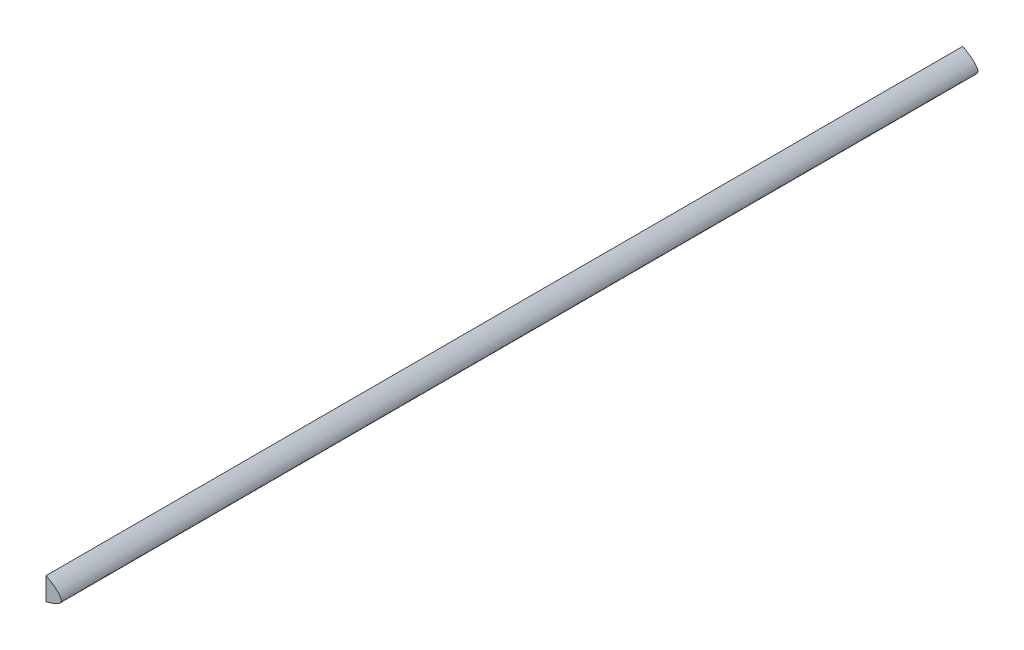
ISO-10303-21;
HEADER;
FILE_DESCRIPTION(('STEP AP214'),'2;1');
FILE_NAME('part.step','',(''),(''),'','','');
FILE_SCHEMA(('AUTOMOTIVE_DESIGN { 1 0 10303 214 1 1 1 1 }'));
ENDSEC;
DATA;
#1=APPLICATION_CONTEXT('core data for automotive mechanical design processes');
#2=APPLICATION_PROTOCOL_DEFINITION('international standard','automotive_design',2000,#1);
#3=PRODUCT_CONTEXT('',#1,'mechanical');
#4=PRODUCT('Part','Part','',(#3));
#5=PRODUCT_RELATED_PRODUCT_CATEGORY('part','',(#4));
#6=PRODUCT_DEFINITION_FORMATION('','',#4);
#7=PRODUCT_DEFINITION_CONTEXT('part definition',#1,'design');
#8=PRODUCT_DEFINITION('design','',#6,#7);
#9=PRODUCT_DEFINITION_SHAPE('','',#8);
#10=(LENGTH_UNIT() NAMED_UNIT(*) SI_UNIT(.MILLI.,.METRE.));
#11=(NAMED_UNIT(*) PLANE_ANGLE_UNIT() SI_UNIT($,.RADIAN.));
#12=(NAMED_UNIT(*) SI_UNIT($,.STERADIAN.) SOLID_ANGLE_UNIT());
#13=UNCERTAINTY_MEASURE_WITH_UNIT(LENGTH_MEASURE(1.E-05),#10,'distance_accuracy_value','');
#14=(GEOMETRIC_REPRESENTATION_CONTEXT(3) GLOBAL_UNCERTAINTY_ASSIGNED_CONTEXT((#13)) GLOBAL_UNIT_ASSIGNED_CONTEXT((#10,
#11,#12)) REPRESENTATION_CONTEXT('',''));
#15=CARTESIAN_POINT('',(0.,0.,0.));
#16=DIRECTION('',(0.,0.,1.));
#17=DIRECTION('',(1.,0.,0.));
#18=AXIS2_PLACEMENT_3D('',#15,#16,#17);
#19=CARTESIAN_POINT('',(0.,0.,-761.999746));
#20=DIRECTION('',(0.,0.,-1.));
#21=DIRECTION('',(-1.,0.,0.));
#22=AXIS2_PLACEMENT_3D('',#19,#20,#21);
#23=PLANE('',#22);
#24=CARTESIAN_POINT('',(-357.6495768,0.,-761.999746));
#25=CARTESIAN_POINT('',(-357.648726861376,-0.0257455572910462,-761.999746));
#26=CARTESIAN_POINT('',(-354.95727209637,0.0430546550360694,-761.999746));
#27=CARTESIAN_POINT('',(-352.252509359615,-0.129032965371311,-761.999746));
#28=CARTESIAN_POINT('',(-345.839521917533,-0.406133073157836,-761.999746));
#29=CARTESIAN_POINT('',(-338.12456303809,-0.910151364784343,-761.999746));
#30=CARTESIAN_POINT('',(-328.210351967454,-1.43852531925133,-761.999746));
#31=CARTESIAN_POINT('',(-316.612136086776,-2.02069580310001,-761.999746));
#32=CARTESIAN_POINT('',(-303.314765848886,-2.69217460861265,-761.999746));
#33=CARTESIAN_POINT('',(-288.537244692712,-3.47532619062215,-761.999746));
#34=CARTESIAN_POINT('',(-272.46518336393,-4.36701221843547,-761.999746));
#35=CARTESIAN_POINT('',(-255.320104090206,-5.3536446318852,-761.999746));
#36=CARTESIAN_POINT('',(-237.326277664919,-6.42526658413433,-761.999746));
#37=CARTESIAN_POINT('',(-218.720973618498,-7.55250034629027,-761.999746));
#38=CARTESIAN_POINT('',(-199.744199132284,-8.71185745862187,-761.999746));
#39=CARTESIAN_POINT('',(-180.642422071267,-9.8572300632981,-761.999746));
#40=CARTESIAN_POINT('',(-161.661678951748,-10.9405310919227,-761.999746));
#41=CARTESIAN_POINT('',(-143.025643591958,-11.8868463949373,-761.999746));
#42=CARTESIAN_POINT('',(-124.905168706553,-12.5651088804298,-761.999746));
#43=CARTESIAN_POINT('',(-107.443529756709,-12.9136554715501,-761.999746));
#44=CARTESIAN_POINT('',(-90.7897217382014,-13.0132010825939,-761.999746));
#45=CARTESIAN_POINT('',(-75.1117351145609,-12.860660166562,-761.999746));
#46=CARTESIAN_POINT('',(-60.5841901433603,-12.4624056014747,-761.999746));
#47=CARTESIAN_POINT('',(-47.3621543247653,-11.8026738466849,-761.999746));
#48=CARTESIAN_POINT('',(-35.582842736121,-10.881324092175,-761.999746));
#49=CARTESIAN_POINT('',(-25.3534528134309,-9.70173739095846,-761.999746));
#50=CARTESIAN_POINT('',(-16.7799983149518,-8.25111039585946,-761.999746));
#51=CARTESIAN_POINT('',(-9.87542917398952,-6.636452020727,-761.999746));
#52=CARTESIAN_POINT('',(-4.80498724836757,-4.65277940167213,-761.999746));
#53=CARTESIAN_POINT('',(-1.25723768747931,-2.92852094482158,-761.999746));
#54=CARTESIAN_POINT('',(0.487670047204104,-0.0180312769451604,-761.999746));
#55=CARTESIAN_POINT('',(-1.18020539645498,2.96932580564775,-761.999746));
#56=CARTESIAN_POINT('',(-3.81583902671143,5.9031060482646,-761.999746));
#57=CARTESIAN_POINT('',(-8.13905195070425,9.10746932339869,-761.999746));
#58=CARTESIAN_POINT('',(-13.8914371976012,12.3237164418778,-761.999746));
#59=CARTESIAN_POINT('',(-21.1318126217946,15.5017839571303,-761.999746));
#60=CARTESIAN_POINT('',(-29.7713974500726,18.5449825075212,-761.999746));
#61=CARTESIAN_POINT('',(-39.7522709934014,21.3790561596477,-761.999746));
#62=CARTESIAN_POINT('',(-50.9728087742978,23.9485342689099,-761.999746));
#63=CARTESIAN_POINT('',(-63.3271747979513,26.1867718902102,-761.999746));
#64=CARTESIAN_POINT('',(-76.6903038222001,28.0307898502846,-761.999746));
#65=CARTESIAN_POINT('',(-90.9433495275859,29.415500622072,-761.999746));
#66=CARTESIAN_POINT('',(-105.989881507942,30.2107947542356,-761.999746));
#67=CARTESIAN_POINT('',(-121.743656538008,30.3921609512369,-761.999746));
#68=CARTESIAN_POINT('',(-138.125753593203,29.9470374556974,-761.999746));
#69=CARTESIAN_POINT('',(-155.046694559356,28.9095802371024,-761.999746));
#70=CARTESIAN_POINT('',(-172.408579332207,27.3328076494178,-761.999746));
#71=CARTESIAN_POINT('',(-190.087035591286,25.3152052593147,-761.999746));
#72=CARTESIAN_POINT('',(-207.920859479651,23.0318128032209,-761.999746));
#73=CARTESIAN_POINT('',(-225.698984189918,20.6027037735159,-761.999746));
#74=CARTESIAN_POINT('',(-243.181526396299,18.091258120494,-761.999746));
#75=CARTESIAN_POINT('',(-260.13922248756,15.5902976030219,-761.999746));
#76=CARTESIAN_POINT('',(-276.339957136469,13.1505380743263,-761.999746));
#77=CARTESIAN_POINT('',(-291.56396185533,10.8192660446522,-761.999746));
#78=CARTESIAN_POINT('',(-305.595219858194,8.6506948413944,-761.999746));
#79=CARTESIAN_POINT('',(-318.248236887196,6.6648279530017,-761.999746));
#80=CARTESIAN_POINT('',(-329.308114231144,4.89193261496094,-761.999746));
#81=CARTESIAN_POINT('',(-338.781253094512,3.26550493388586,-761.999746));
#82=CARTESIAN_POINT('',(-346.176304677791,1.86759950346183,-761.999746));
#83=CARTESIAN_POINT('',(-352.370656862766,0.802364026765671,-761.999746));
#84=CARTESIAN_POINT('',(-354.99806757049,0.293773121072747,-761.999746));
#85=CARTESIAN_POINT('',(-357.650424016708,0.025663107521496,-761.999746));
#86=CARTESIAN_POINT('',(-357.6495768,0.,-761.999746));
#87=B_SPLINE_CURVE_WITH_KNOTS('',3,(#24,#25,#26,#27,#28,#29,#30,#31,#32,#33,#34,#35,#36,#37,#38,
#39,#40,#41,#42,#43,#44,#45,#46,#47,#48,#49,#50,#51,#52,#53,#54,#55,#56,#57,#58,#59,#60,#61,#62,
#63,#64,#65,#66,#67,#68,#69,#70,#71,#72,#73,#74,#75,#76,#77,#78,#79,#80,#81,#82,#83,#84,#85,
#86),.UNSPECIFIED.,.T.,.F.,(4,1,1,1,1,1,1,1,1,1,1,1,1,1,1,1,1,1,1,1,1,1,1,1,1,1,1,1,1,1,1,1,1,1,
1,1,1,1,1,1,1,1,1,1,1,1,1,1,1,1,1,1,1,1,1,1,1,1,1,1,4),(0.,0.00175369780816892,
0.00688865956314488,0.0150923025389886,0.0260705624445412,0.0396341231207822,0.0556736872431635,
0.0740348611839932,0.0944591609311742,0.116662173474013,0.140358718672501,0.165224083535155,
0.190937550434525,0.217163338877499,0.243564475453284,0.269788575421464,0.295501431380781,
0.320452916753595,0.344503634568004,0.367464141025741,0.389074612810261,0.409105471364504,
0.427344498250884,0.443617520922597,0.457786354918441,0.469750876859431,0.47945377095506,
0.486908806682988,0.492196223633669,0.495548631984138,0.499383016984256,0.504909969436302,
0.512185650881719,0.521248351858979,0.532096115453832,0.544700028478094,0.558973210086569,
0.574822851386883,0.592114304239246,0.610691624255903,0.630393060413666,0.651103436631961,
0.67275850299212,0.695294236993928,0.71861636740432,0.742601232614042,0.767120584088619,
0.791930052571172,0.816685006986028,0.841056018593425,0.864706871110748,0.887315386476924,
0.908565467206016,0.928165908499566,0.945829219590711,0.961305843038647,0.9744276754812,
0.985119780533907,0.993172635388474,0.998251918383336,1.),.UNSPECIFIED.);
#88=CARTESIAN_POINT('',(-12.7000000000002,-7.2626912939508,-761.999746));
#89=VERTEX_POINT('',#88);
#90=CARTESIAN_POINT('',(-12.7,11.588344324976,-761.999746));
#91=VERTEX_POINT('',#90);
#92=EDGE_CURVE('E11',#89,#91,#87,.T.);
#93=ORIENTED_EDGE('',*,*,#92,.F.);
#94=DIRECTION('',(0.,-1.,0.));
#95=VECTOR('',#94,1.);
#96=CARTESIAN_POINT('',(-12.7000000000002,1.66533453693773E-13,-761.999746));
#97=LINE('',#96,#95);
#98=EDGE_CURVE('E55',#91,#89,#97,.T.);
#99=ORIENTED_EDGE('',*,*,#98,.F.);
#100=EDGE_LOOP('',(#93,#99));
#101=FACE_BOUND('',#100,.T.);
#102=ADVANCED_FACE('F33',(#101),#23,.T.);
#103=CARTESIAN_POINT('',(-1.2677296123001,2.86302360731041,0.));
#104=DIRECTION('',(0.,0.,-1.));
#105=DIRECTION('',(-1.,0.,0.));
#106=AXIS2_PLACEMENT_3D('',#103,#104,#105);
#107=PLANE('',#106);
#108=DIRECTION('',(0.,-1.,0.));
#109=VECTOR('',#108,1.);
#110=CARTESIAN_POINT('',(-12.7000000000002,1.66533453693773E-13,0.));
#111=LINE('',#110,#109);
#112=CARTESIAN_POINT('',(-12.7,11.588344324976,0.));
#113=VERTEX_POINT('',#112);
#114=CARTESIAN_POINT('',(-12.7000000000003,-7.2626912939508,0.));
#115=VERTEX_POINT('',#114);
#116=EDGE_CURVE('E50',#113,#115,#111,.T.);
#117=ORIENTED_EDGE('',*,*,#116,.T.);
#118=CARTESIAN_POINT('',(-357.6495768,0.,0.));
#119=CARTESIAN_POINT('',(-357.648726861376,-0.0257455572910462,0.));
#120=CARTESIAN_POINT('',(-354.95727209637,0.0430546550360694,0.));
#121=CARTESIAN_POINT('',(-352.252509359615,-0.129032965371311,0.));
#122=CARTESIAN_POINT('',(-345.839521917533,-0.406133073157836,0.));
#123=CARTESIAN_POINT('',(-338.12456303809,-0.910151364784343,0.));
#124=CARTESIAN_POINT('',(-328.210351967454,-1.43852531925133,0.));
#125=CARTESIAN_POINT('',(-316.612136086776,-2.02069580310001,0.));
#126=CARTESIAN_POINT('',(-303.314765848886,-2.69217460861265,0.));
#127=CARTESIAN_POINT('',(-288.537244692712,-3.47532619062215,0.));
#128=CARTESIAN_POINT('',(-272.46518336393,-4.36701221843547,0.));
#129=CARTESIAN_POINT('',(-255.320104090206,-5.3536446318852,0.));
#130=CARTESIAN_POINT('',(-237.326277664919,-6.42526658413433,0.));
#131=CARTESIAN_POINT('',(-218.720973618498,-7.55250034629027,0.));
#132=CARTESIAN_POINT('',(-199.744199132284,-8.71185745862187,0.));
#133=CARTESIAN_POINT('',(-180.642422071267,-9.8572300632981,0.));
#134=CARTESIAN_POINT('',(-161.661678951748,-10.9405310919227,0.));
#135=CARTESIAN_POINT('',(-143.025643591958,-11.8868463949373,0.));
#136=CARTESIAN_POINT('',(-124.905168706553,-12.5651088804298,0.));
#137=CARTESIAN_POINT('',(-107.443529756709,-12.9136554715501,0.));
#138=CARTESIAN_POINT('',(-90.7897217382014,-13.0132010825939,0.));
#139=CARTESIAN_POINT('',(-75.1117351145609,-12.860660166562,0.));
#140=CARTESIAN_POINT('',(-60.5841901433603,-12.4624056014747,0.));
#141=CARTESIAN_POINT('',(-47.3621543247653,-11.8026738466849,0.));
#142=CARTESIAN_POINT('',(-35.582842736121,-10.881324092175,0.));
#143=CARTESIAN_POINT('',(-25.3534528134309,-9.70173739095846,0.));
#144=CARTESIAN_POINT('',(-16.7799983149518,-8.25111039585946,0.));
#145=CARTESIAN_POINT('',(-9.87542917398952,-6.636452020727,0.));
#146=CARTESIAN_POINT('',(-4.80498724836757,-4.65277940167213,0.));
#147=CARTESIAN_POINT('',(-1.25723768747931,-2.92852094482158,0.));
#148=CARTESIAN_POINT('',(0.487670047204104,-0.0180312769451604,0.));
#149=CARTESIAN_POINT('',(-1.18020539645498,2.96932580564775,0.));
#150=CARTESIAN_POINT('',(-3.81583902671143,5.9031060482646,0.));
#151=CARTESIAN_POINT('',(-8.13905195070425,9.10746932339869,0.));
#152=CARTESIAN_POINT('',(-13.8914371976012,12.3237164418778,0.));
#153=CARTESIAN_POINT('',(-21.1318126217946,15.5017839571303,0.));
#154=CARTESIAN_POINT('',(-29.7713974500726,18.5449825075212,0.));
#155=CARTESIAN_POINT('',(-39.7522709934014,21.3790561596477,0.));
#156=CARTESIAN_POINT('',(-50.9728087742978,23.9485342689099,0.));
#157=CARTESIAN_POINT('',(-63.3271747979513,26.1867718902102,0.));
#158=CARTESIAN_POINT('',(-76.6903038222001,28.0307898502846,0.));
#159=CARTESIAN_POINT('',(-90.9433495275859,29.415500622072,0.));
#160=CARTESIAN_POINT('',(-105.989881507942,30.2107947542356,0.));
#161=CARTESIAN_POINT('',(-121.743656538008,30.3921609512369,0.));
#162=CARTESIAN_POINT('',(-138.125753593203,29.9470374556974,0.));
#163=CARTESIAN_POINT('',(-155.046694559356,28.9095802371024,0.));
#164=CARTESIAN_POINT('',(-172.408579332207,27.3328076494178,0.));
#165=CARTESIAN_POINT('',(-190.087035591286,25.3152052593147,0.));
#166=CARTESIAN_POINT('',(-207.920859479651,23.0318128032209,0.));
#167=CARTESIAN_POINT('',(-225.698984189918,20.6027037735159,0.));
#168=CARTESIAN_POINT('',(-243.181526396299,18.091258120494,0.));
#169=CARTESIAN_POINT('',(-260.13922248756,15.5902976030219,0.));
#170=CARTESIAN_POINT('',(-276.339957136469,13.1505380743263,0.));
#171=CARTESIAN_POINT('',(-291.56396185533,10.8192660446522,0.));
#172=CARTESIAN_POINT('',(-305.595219858194,8.6506948413944,0.));
#173=CARTESIAN_POINT('',(-318.248236887196,6.6648279530017,0.));
#174=CARTESIAN_POINT('',(-329.308114231144,4.89193261496094,0.));
#175=CARTESIAN_POINT('',(-338.781253094512,3.26550493388586,0.));
#176=CARTESIAN_POINT('',(-346.176304677791,1.86759950346183,0.));
#177=CARTESIAN_POINT('',(-352.370656862766,0.802364026765671,0.));
#178=CARTESIAN_POINT('',(-354.99806757049,0.293773121072747,0.));
#179=CARTESIAN_POINT('',(-357.650424016708,0.025663107521496,0.));
#180=CARTESIAN_POINT('',(-357.6495768,0.,0.));
#181=B_SPLINE_CURVE_WITH_KNOTS('',3,(#118,#119,#120,#121,#122,#123,#124,#125,#126,#127,#128,
#129,#130,#131,#132,#133,#134,#135,#136,#137,#138,#139,#140,#141,#142,#143,#144,#145,#146,#147,
#148,#149,#150,#151,#152,#153,#154,#155,#156,#157,#158,#159,#160,#161,#162,#163,#164,#165,#166,
#167,#168,#169,#170,#171,#172,#173,#174,#175,#176,#177,#178,#179,#180),.UNSPECIFIED.,.T.,.F.,(4,
1,1,1,1,1,1,1,1,1,1,1,1,1,1,1,1,1,1,1,1,1,1,1,1,1,1,1,1,1,1,1,1,1,1,1,1,1,1,1,1,1,1,1,1,1,1,1,1,
1,1,1,1,1,1,1,1,1,1,1,4),(0.,0.00175369780816892,0.00688865956314488,0.0150923025389886,
0.0260705624445412,0.0396341231207822,0.0556736872431635,0.0740348611839932,0.0944591609311742,
0.116662173474013,0.140358718672501,0.165224083535155,0.190937550434525,0.217163338877499,
0.243564475453284,0.269788575421464,0.295501431380781,0.320452916753595,0.344503634568004,
0.367464141025741,0.389074612810261,0.409105471364504,0.427344498250884,0.443617520922597,
0.457786354918441,0.469750876859431,0.47945377095506,0.486908806682988,0.492196223633669,
0.495548631984138,0.499383016984256,0.504909969436302,0.512185650881719,0.521248351858979,
0.532096115453832,0.544700028478094,0.558973210086569,0.574822851386883,0.592114304239246,
0.610691624255903,0.630393060413666,0.651103436631961,0.67275850299212,0.695294236993928,
0.71861636740432,0.742601232614042,0.767120584088619,0.791930052571172,0.816685006986028,
0.841056018593425,0.864706871110748,0.887315386476924,0.908565467206016,0.928165908499566,
0.945829219590711,0.961305843038647,0.9744276754812,0.985119780533907,0.993172635388474,
0.998251918383336,1.),.UNSPECIFIED.);
#182=EDGE_CURVE('E43',#115,#113,#181,.T.);
#183=ORIENTED_EDGE('',*,*,#182,.T.);
#184=EDGE_LOOP('',(#117,#183));
#185=FACE_BOUND('',#184,.T.);
#186=ADVANCED_FACE('F84',(#185),#107,.F.);
#187=CARTESIAN_POINT('',(-357.6495768,0.,-1123.4349097049));
#188=CARTESIAN_POINT('',(-357.648726861376,-0.0257455572910462,-1123.4349097049));
#189=CARTESIAN_POINT('',(-354.95727209637,0.0430546550360694,-1123.4349097049));
#190=CARTESIAN_POINT('',(-352.252509359615,-0.129032965371311,-1123.4349097049));
#191=CARTESIAN_POINT('',(-345.839521917533,-0.406133073157836,-1123.4349097049));
#192=CARTESIAN_POINT('',(-338.12456303809,-0.910151364784343,-1123.4349097049));
#193=CARTESIAN_POINT('',(-328.210351967454,-1.43852531925133,-1123.4349097049));
#194=CARTESIAN_POINT('',(-316.612136086776,-2.02069580310001,-1123.4349097049));
#195=CARTESIAN_POINT('',(-303.314765848886,-2.69217460861265,-1123.4349097049));
#196=CARTESIAN_POINT('',(-288.537244692712,-3.47532619062215,-1123.4349097049));
#197=CARTESIAN_POINT('',(-272.46518336393,-4.36701221843547,-1123.4349097049));
#198=CARTESIAN_POINT('',(-255.320104090206,-5.3536446318852,-1123.4349097049));
#199=CARTESIAN_POINT('',(-237.326277664919,-6.42526658413433,-1123.4349097049));
#200=CARTESIAN_POINT('',(-218.720973618498,-7.55250034629027,-1123.4349097049));
#201=CARTESIAN_POINT('',(-199.744199132284,-8.71185745862187,-1123.4349097049));
#202=CARTESIAN_POINT('',(-180.642422071267,-9.8572300632981,-1123.4349097049));
#203=CARTESIAN_POINT('',(-161.661678951748,-10.9405310919227,-1123.4349097049));
#204=CARTESIAN_POINT('',(-143.025643591958,-11.8868463949373,-1123.4349097049));
#205=CARTESIAN_POINT('',(-124.905168706553,-12.5651088804298,-1123.4349097049));
#206=CARTESIAN_POINT('',(-107.443529756709,-12.9136554715501,-1123.4349097049));
#207=CARTESIAN_POINT('',(-90.7897217382014,-13.0132010825939,-1123.4349097049));
#208=CARTESIAN_POINT('',(-75.1117351145609,-12.860660166562,-1123.4349097049));
#209=CARTESIAN_POINT('',(-60.5841901433603,-12.4624056014747,-1123.4349097049));
#210=CARTESIAN_POINT('',(-47.3621543247653,-11.8026738466849,-1123.4349097049));
#211=CARTESIAN_POINT('',(-35.582842736121,-10.881324092175,-1123.4349097049));
#212=CARTESIAN_POINT('',(-25.3534528134309,-9.70173739095846,-1123.4349097049));
#213=CARTESIAN_POINT('',(-16.7799983149518,-8.25111039585946,-1123.4349097049));
#214=CARTESIAN_POINT('',(-9.87542917398952,-6.636452020727,-1123.4349097049));
#215=CARTESIAN_POINT('',(-4.80498724836757,-4.65277940167213,-1123.4349097049));
#216=CARTESIAN_POINT('',(-1.25723768747931,-2.92852094482158,-1123.4349097049));
#217=CARTESIAN_POINT('',(0.487670047204104,-0.0180312769451604,-1123.4349097049));
#218=CARTESIAN_POINT('',(-1.18020539645498,2.96932580564775,-1123.4349097049));
#219=CARTESIAN_POINT('',(-3.81583902671143,5.9031060482646,-1123.4349097049));
#220=CARTESIAN_POINT('',(-8.13905195070425,9.10746932339869,-1123.4349097049));
#221=CARTESIAN_POINT('',(-13.8914371976012,12.3237164418778,-1123.4349097049));
#222=CARTESIAN_POINT('',(-21.1318126217946,15.5017839571303,-1123.4349097049));
#223=CARTESIAN_POINT('',(-29.7713974500726,18.5449825075212,-1123.4349097049));
#224=CARTESIAN_POINT('',(-39.7522709934014,21.3790561596477,-1123.4349097049));
#225=CARTESIAN_POINT('',(-50.9728087742978,23.9485342689099,-1123.4349097049));
#226=CARTESIAN_POINT('',(-63.3271747979513,26.1867718902102,-1123.4349097049));
#227=CARTESIAN_POINT('',(-76.6903038222001,28.0307898502846,-1123.4349097049));
#228=CARTESIAN_POINT('',(-90.9433495275859,29.415500622072,-1123.4349097049));
#229=CARTESIAN_POINT('',(-105.989881507942,30.2107947542356,-1123.4349097049));
#230=CARTESIAN_POINT('',(-121.743656538008,30.3921609512369,-1123.4349097049));
#231=CARTESIAN_POINT('',(-138.125753593203,29.9470374556974,-1123.4349097049));
#232=CARTESIAN_POINT('',(-155.046694559356,28.9095802371024,-1123.4349097049));
#233=CARTESIAN_POINT('',(-172.408579332207,27.3328076494178,-1123.4349097049));
#234=CARTESIAN_POINT('',(-190.087035591286,25.3152052593147,-1123.4349097049));
#235=CARTESIAN_POINT('',(-207.920859479651,23.0318128032209,-1123.4349097049));
#236=CARTESIAN_POINT('',(-225.698984189918,20.6027037735159,-1123.4349097049));
#237=CARTESIAN_POINT('',(-243.181526396299,18.091258120494,-1123.4349097049));
#238=CARTESIAN_POINT('',(-260.13922248756,15.5902976030219,-1123.4349097049));
#239=CARTESIAN_POINT('',(-276.339957136469,13.1505380743263,-1123.4349097049));
#240=CARTESIAN_POINT('',(-291.56396185533,10.8192660446522,-1123.4349097049));
#241=CARTESIAN_POINT('',(-305.595219858194,8.6506948413944,-1123.4349097049));
#242=CARTESIAN_POINT('',(-318.248236887196,6.6648279530017,-1123.4349097049));
#243=CARTESIAN_POINT('',(-329.308114231144,4.89193261496094,-1123.4349097049));
#244=CARTESIAN_POINT('',(-338.781253094512,3.26550493388586,-1123.4349097049));
#245=CARTESIAN_POINT('',(-346.176304677791,1.86759950346183,-1123.4349097049));
#246=CARTESIAN_POINT('',(-352.370656862766,0.802364026765671,-1123.4349097049));
#247=CARTESIAN_POINT('',(-354.99806757049,0.293773121072747,-1123.4349097049));
#248=CARTESIAN_POINT('',(-357.650424016708,0.025663107521496,-1123.4349097049));
#249=CARTESIAN_POINT('',(-357.6495768,0.,-1123.4349097049));
#250=B_SPLINE_CURVE_WITH_KNOTS('',3,(#187,#188,#189,#190,#191,#192,#193,#194,#195,#196,#197,
#198,#199,#200,#201,#202,#203,#204,#205,#206,#207,#208,#209,#210,#211,#212,#213,#214,#215,#216,
#217,#218,#219,#220,#221,#222,#223,#224,#225,#226,#227,#228,#229,#230,#231,#232,#233,#234,#235,
#236,#237,#238,#239,#240,#241,#242,#243,#244,#245,#246,#247,#248,#249),.UNSPECIFIED.,.T.,.F.,(4,
1,1,1,1,1,1,1,1,1,1,1,1,1,1,1,1,1,1,1,1,1,1,1,1,1,1,1,1,1,1,1,1,1,1,1,1,1,1,1,1,1,1,1,1,1,1,1,1,
1,1,1,1,1,1,1,1,1,1,1,4),(0.,0.00175369780816892,0.00688865956314488,0.0150923025389886,
0.0260705624445412,0.0396341231207822,0.0556736872431635,0.0740348611839932,0.0944591609311742,
0.116662173474013,0.140358718672501,0.165224083535155,0.190937550434525,0.217163338877499,
0.243564475453284,0.269788575421464,0.295501431380781,0.320452916753595,0.344503634568004,
0.367464141025741,0.389074612810261,0.409105471364504,0.427344498250884,0.443617520922597,
0.457786354918441,0.469750876859431,0.47945377095506,0.486908806682988,0.492196223633669,
0.495548631984138,0.499383016984256,0.504909969436302,0.512185650881719,0.521248351858979,
0.532096115453832,0.544700028478094,0.558973210086569,0.574822851386883,0.592114304239246,
0.610691624255903,0.630393060413666,0.651103436631961,0.67275850299212,0.695294236993928,
0.71861636740432,0.742601232614042,0.767120584088619,0.791930052571172,0.816685006986028,
0.841056018593425,0.864706871110748,0.887315386476924,0.908565467206016,0.928165908499566,
0.945829219590711,0.961305843038647,0.9744276754812,0.985119780533907,0.993172635388474,
0.998251918383336,1.),.UNSPECIFIED.);
#251=DIRECTION('',(0.,0.,1.));
#252=VECTOR('',#251,1.);
#253=SURFACE_OF_LINEAR_EXTRUSION('',#250,#252);
#254=ORIENTED_EDGE('',*,*,#182,.F.);
#255=DIRECTION('',(0.,0.,1.));
#256=VECTOR('',#255,1.);
#257=CARTESIAN_POINT('',(-12.7000000000003,-7.2626912939508,-1123.4349097049));
#258=LINE('',#257,#256);
#259=EDGE_CURVE('E65',#89,#115,#258,.T.);
#260=ORIENTED_EDGE('',*,*,#259,.F.);
#261=ORIENTED_EDGE('',*,*,#92,.T.);
#262=DIRECTION('',(0.,0.,1.));
#263=VECTOR('',#262,1.);
#264=CARTESIAN_POINT('',(-12.7,11.588344324976,-1123.4349097049));
#265=LINE('',#264,#263);
#266=EDGE_CURVE('E60',#91,#113,#265,.T.);
#267=ORIENTED_EDGE('',*,*,#266,.T.);
#268=EDGE_LOOP('',(#254,#260,#261,#267));
#269=FACE_BOUND('',#268,.T.);
#270=ADVANCED_FACE('F70',(#269),#253,.T.);
#271=CARTESIAN_POINT('',(-12.7000000000002,1.66533453693773E-13,-1123.4349097049));
#272=DIRECTION('',(-1.,0.,0.));
#273=DIRECTION('',(0.,-1.,0.));
#274=AXIS2_PLACEMENT_3D('',#271,#272,#273);
#275=PLANE('',#274);
#276=ORIENTED_EDGE('',*,*,#98,.T.);
#277=ORIENTED_EDGE('',*,*,#259,.T.);
#278=ORIENTED_EDGE('',*,*,#116,.F.);
#279=ORIENTED_EDGE('',*,*,#266,.F.);
#280=EDGE_LOOP('',(#276,#277,#278,#279));
#281=FACE_BOUND('',#280,.T.);
#282=ADVANCED_FACE('F61',(#281),#275,.T.);
#283=CLOSED_SHELL('',(#102,#186,#270,#282));
#284=MANIFOLD_SOLID_BREP('B2',#283);
#285=ADVANCED_BREP_SHAPE_REPRESENTATION('',(#18,#284),#14);
#286=SHAPE_DEFINITION_REPRESENTATION(#9,#285);
ENDSEC;
END-ISO-10303-21;
